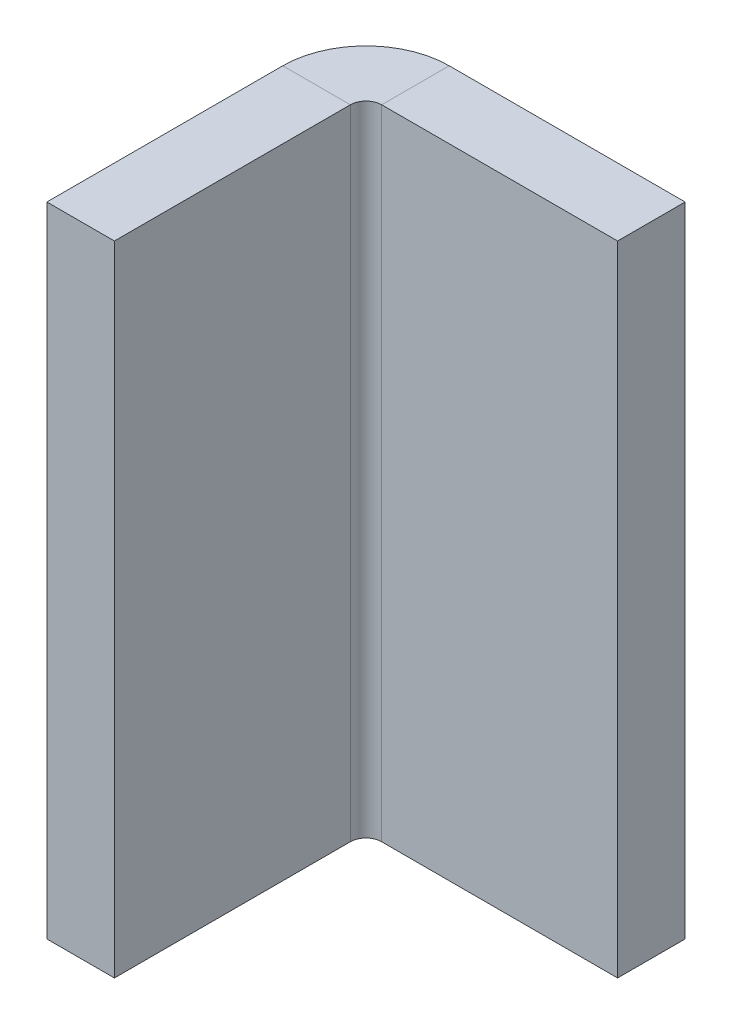
ISO-10303-21;
HEADER;
FILE_DESCRIPTION(('STEP AP214'),'2;1');
FILE_NAME('part.step','',(''),(''),'','','');
FILE_SCHEMA(('AUTOMOTIVE_DESIGN { 1 0 10303 214 1 1 1 1 }'));
ENDSEC;
DATA;
#1=APPLICATION_CONTEXT('core data for automotive mechanical design processes');
#2=APPLICATION_PROTOCOL_DEFINITION('international standard','automotive_design',2000,#1);
#3=PRODUCT_CONTEXT('',#1,'mechanical');
#4=PRODUCT('Part','Part','',(#3));
#5=PRODUCT_RELATED_PRODUCT_CATEGORY('part','',(#4));
#6=PRODUCT_DEFINITION_FORMATION('','',#4);
#7=PRODUCT_DEFINITION_CONTEXT('part definition',#1,'design');
#8=PRODUCT_DEFINITION('design','',#6,#7);
#9=PRODUCT_DEFINITION_SHAPE('','',#8);
#10=(LENGTH_UNIT() NAMED_UNIT(*) SI_UNIT(.MILLI.,.METRE.));
#11=(NAMED_UNIT(*) PLANE_ANGLE_UNIT() SI_UNIT($,.RADIAN.));
#12=(NAMED_UNIT(*) SI_UNIT($,.STERADIAN.) SOLID_ANGLE_UNIT());
#13=UNCERTAINTY_MEASURE_WITH_UNIT(LENGTH_MEASURE(1.E-05),#10,'distance_accuracy_value','');
#14=(GEOMETRIC_REPRESENTATION_CONTEXT(3) GLOBAL_UNCERTAINTY_ASSIGNED_CONTEXT((#13)) GLOBAL_UNIT_ASSIGNED_CONTEXT((#10,
#11,#12)) REPRESENTATION_CONTEXT('',''));
#15=CARTESIAN_POINT('',(0.,0.,0.));
#16=DIRECTION('',(0.,0.,1.));
#17=DIRECTION('',(1.,0.,0.));
#18=AXIS2_PLACEMENT_3D('',#15,#16,#17);
#19=CARTESIAN_POINT('',(15.,-15.,-3.17500000000001));
#20=DIRECTION('',(0.,0.,1.));
#21=DIRECTION('',(0.,-1.,0.));
#22=AXIS2_PLACEMENT_3D('',#19,#20,#21);
#23=PLANE('',#22);
#24=DIRECTION('',(0.,-1.,0.));
#25=VECTOR('',#24,1.);
#26=CARTESIAN_POINT('',(3.9116,-15.,-3.175));
#27=LINE('',#26,#25);
#28=CARTESIAN_POINT('',(3.9116,-15.,-3.175));
#29=VERTEX_POINT('',#28);
#30=CARTESIAN_POINT('',(3.9116,15.,-3.175));
#31=VERTEX_POINT('',#30);
#32=EDGE_CURVE('E164',#29,#31,#27,.F.);
#33=ORIENTED_EDGE('',*,*,#32,.T.);
#34=DIRECTION('',(-1.,0.,0.));
#35=VECTOR('',#34,1.);
#36=CARTESIAN_POINT('',(15.,15.,-3.175));
#37=LINE('',#36,#35);
#38=CARTESIAN_POINT('',(15.,15.,-3.175));
#39=VERTEX_POINT('',#38);
#40=EDGE_CURVE('E13',#39,#31,#37,.T.);
#41=ORIENTED_EDGE('',*,*,#40,.F.);
#42=DIRECTION('',(0.,1.,0.));
#43=VECTOR('',#42,1.);
#44=CARTESIAN_POINT('',(15.,-15.,-3.17500000000001));
#45=LINE('',#44,#43);
#46=CARTESIAN_POINT('',(15.,-15.,-3.17500000000001));
#47=VERTEX_POINT('',#46);
#48=EDGE_CURVE('E185',#47,#39,#45,.T.);
#49=ORIENTED_EDGE('',*,*,#48,.F.);
#50=DIRECTION('',(-1.,0.,0.));
#51=VECTOR('',#50,1.);
#52=CARTESIAN_POINT('',(15.,-15.,-3.17500000000001));
#53=LINE('',#52,#51);
#54=EDGE_CURVE('E70',#47,#29,#53,.T.);
#55=ORIENTED_EDGE('',*,*,#54,.T.);
#56=EDGE_LOOP('',(#33,#41,#49,#55));
#57=FACE_BOUND('',#56,.T.);
#58=ADVANCED_FACE('F56',(#57),#23,.F.);
#59=CARTESIAN_POINT('',(15.,-15.,0.));
#60=DIRECTION('',(0.,0.,1.));
#61=DIRECTION('',(0.,-1.,0.));
#62=AXIS2_PLACEMENT_3D('',#59,#60,#61);
#63=PLANE('',#62);
#64=DIRECTION('',(-1.,0.,0.));
#65=VECTOR('',#64,1.);
#66=CARTESIAN_POINT('',(15.,15.,0.));
#67=LINE('',#66,#65);
#68=CARTESIAN_POINT('',(15.,15.,0.));
#69=VERTEX_POINT('',#68);
#70=CARTESIAN_POINT('',(3.9116,15.,0.));
#71=VERTEX_POINT('',#70);
#72=EDGE_CURVE('E63',#69,#71,#67,.T.);
#73=ORIENTED_EDGE('',*,*,#72,.T.);
#74=DIRECTION('',(0.,-1.,0.));
#75=VECTOR('',#74,1.);
#76=CARTESIAN_POINT('',(3.9116,-15.,0.));
#77=LINE('',#76,#75);
#78=CARTESIAN_POINT('',(3.9116,-15.,0.));
#79=VERTEX_POINT('',#78);
#80=EDGE_CURVE('E176',#79,#71,#77,.F.);
#81=ORIENTED_EDGE('',*,*,#80,.F.);
#82=DIRECTION('',(-1.,0.,0.));
#83=VECTOR('',#82,1.);
#84=CARTESIAN_POINT('',(15.,-15.,0.));
#85=LINE('',#84,#83);
#86=CARTESIAN_POINT('',(15.,-15.,0.));
#87=VERTEX_POINT('',#86);
#88=EDGE_CURVE('E78',#87,#79,#85,.T.);
#89=ORIENTED_EDGE('',*,*,#88,.F.);
#90=DIRECTION('',(0.,1.,0.));
#91=VECTOR('',#90,1.);
#92=CARTESIAN_POINT('',(15.,-15.,0.));
#93=LINE('',#92,#91);
#94=EDGE_CURVE('E191',#87,#69,#93,.T.);
#95=ORIENTED_EDGE('',*,*,#94,.T.);
#96=EDGE_LOOP('',(#73,#81,#89,#95));
#97=FACE_BOUND('',#96,.T.);
#98=ADVANCED_FACE('F197',(#97),#63,.T.);
#99=CARTESIAN_POINT('',(15.,-15.,-3.17500000000001));
#100=DIRECTION('',(0.,-1.,0.));
#101=DIRECTION('',(0.,0.,-1.));
#102=AXIS2_PLACEMENT_3D('',#99,#100,#101);
#103=PLANE('',#102);
#104=ORIENTED_EDGE('',*,*,#88,.T.);
#105=DIRECTION('',(0.,0.,-1.));
#106=VECTOR('',#105,1.);
#107=CARTESIAN_POINT('',(3.9116,-15.,0.));
#108=LINE('',#107,#106);
#109=EDGE_CURVE('E170',#79,#29,#108,.T.);
#110=ORIENTED_EDGE('',*,*,#109,.T.);
#111=ORIENTED_EDGE('',*,*,#54,.F.);
#112=DIRECTION('',(0.,0.,1.));
#113=VECTOR('',#112,1.);
#114=CARTESIAN_POINT('',(15.,-15.,-3.17500000000001));
#115=LINE('',#114,#113);
#116=EDGE_CURVE('E193',#47,#87,#115,.T.);
#117=ORIENTED_EDGE('',*,*,#116,.T.);
#118=EDGE_LOOP('',(#104,#110,#111,#117));
#119=FACE_BOUND('',#118,.T.);
#120=ADVANCED_FACE('F220',(#119),#103,.T.);
#121=CARTESIAN_POINT('',(15.,15.,0.));
#122=DIRECTION('',(0.,1.,0.));
#123=DIRECTION('',(0.,0.,1.));
#124=AXIS2_PLACEMENT_3D('',#121,#122,#123);
#125=PLANE('',#124);
#126=DIRECTION('',(0.,0.,-1.));
#127=VECTOR('',#126,1.);
#128=CARTESIAN_POINT('',(3.9116,15.,0.));
#129=LINE('',#128,#127);
#130=EDGE_CURVE('E182',#71,#31,#129,.T.);
#131=ORIENTED_EDGE('',*,*,#130,.F.);
#132=ORIENTED_EDGE('',*,*,#72,.F.);
#133=DIRECTION('',(0.,0.,-1.));
#134=VECTOR('',#133,1.);
#135=CARTESIAN_POINT('',(15.,15.,0.));
#136=LINE('',#135,#134);
#137=EDGE_CURVE('E188',#69,#39,#136,.T.);
#138=ORIENTED_EDGE('',*,*,#137,.T.);
#139=ORIENTED_EDGE('',*,*,#40,.T.);
#140=EDGE_LOOP('',(#131,#132,#138,#139));
#141=FACE_BOUND('',#140,.T.);
#142=ADVANCED_FACE('F225',(#141),#125,.T.);
#143=CARTESIAN_POINT('',(15.,0.,0.));
#144=DIRECTION('',(-1.,0.,0.));
#145=DIRECTION('',(0.,0.,1.));
#146=AXIS2_PLACEMENT_3D('',#143,#144,#145);
#147=PLANE('',#146);
#148=ORIENTED_EDGE('',*,*,#48,.T.);
#149=ORIENTED_EDGE('',*,*,#137,.F.);
#150=ORIENTED_EDGE('',*,*,#94,.F.);
#151=ORIENTED_EDGE('',*,*,#116,.F.);
#152=EDGE_LOOP('',(#148,#149,#150,#151));
#153=FACE_BOUND('',#152,.T.);
#154=ADVANCED_FACE('F223',(#153),#147,.F.);
#155=CARTESIAN_POINT('',(3.9116,15.,0.736600000000003));
#156=DIRECTION('',(0.,1.,0.));
#157=DIRECTION('',(0.,0.,1.));
#158=AXIS2_PLACEMENT_3D('',#155,#156,#157);
#159=PLANE('',#158);
#160=DIRECTION('',(1.,0.,0.));
#161=VECTOR('',#160,1.);
#162=CARTESIAN_POINT('',(0.,15.,0.736599999999989));
#163=LINE('',#162,#161);
#164=CARTESIAN_POINT('',(3.175,15.,0.736600000000001));
#165=VERTEX_POINT('',#164);
#166=CARTESIAN_POINT('',(0.,15.,0.736599999999989));
#167=VERTEX_POINT('',#166);
#168=EDGE_CURVE('E146',#165,#167,#163,.F.);
#169=ORIENTED_EDGE('',*,*,#168,.F.);
#170=CARTESIAN_POINT('',(3.9116,15.,0.736600000000003));
#171=DIRECTION('',(0.,-1.,0.));
#172=DIRECTION('',(0.,0.,-1.));
#173=AXIS2_PLACEMENT_3D('',#170,#171,#172);
#174=CIRCLE('',#173,0.736600000000001);
#175=EDGE_CURVE('E173',#71,#165,#174,.F.);
#176=ORIENTED_EDGE('',*,*,#175,.F.);
#177=ORIENTED_EDGE('',*,*,#130,.T.);
#178=CARTESIAN_POINT('',(3.9116,15.,0.736600000000003));
#179=DIRECTION('',(0.,-1.,0.));
#180=DIRECTION('',(0.,0.,-1.));
#181=AXIS2_PLACEMENT_3D('',#178,#179,#180);
#182=CIRCLE('',#181,3.9116);
#183=EDGE_CURVE('E166',#31,#167,#182,.F.);
#184=ORIENTED_EDGE('',*,*,#183,.T.);
#185=EDGE_LOOP('',(#169,#176,#177,#184));
#186=FACE_BOUND('',#185,.T.);
#187=ADVANCED_FACE('F206',(#186),#159,.T.);
#188=CARTESIAN_POINT('',(3.9116,-15.,0.736599999999997));
#189=DIRECTION('',(0.,1.,0.));
#190=DIRECTION('',(0.,0.,1.));
#191=AXIS2_PLACEMENT_3D('',#188,#189,#190);
#192=PLANE('',#191);
#193=CARTESIAN_POINT('',(3.9116,-15.,0.736599999999997));
#194=DIRECTION('',(0.,-1.,0.));
#195=DIRECTION('',(0.,0.,-1.));
#196=AXIS2_PLACEMENT_3D('',#193,#194,#195);
#197=CIRCLE('',#196,0.736600000000001);
#198=CARTESIAN_POINT('',(3.175,-15.,0.736599999999994));
#199=VERTEX_POINT('',#198);
#200=EDGE_CURVE('E179',#199,#79,#197,.T.);
#201=ORIENTED_EDGE('',*,*,#200,.F.);
#202=DIRECTION('',(1.,0.,0.));
#203=VECTOR('',#202,1.);
#204=CARTESIAN_POINT('',(3.175,-15.,0.736599999999995));
#205=LINE('',#204,#203);
#206=CARTESIAN_POINT('',(0.,-15.,0.736599999999984));
#207=VERTEX_POINT('',#206);
#208=EDGE_CURVE('E158',#199,#207,#205,.F.);
#209=ORIENTED_EDGE('',*,*,#208,.T.);
#210=CARTESIAN_POINT('',(3.9116,-15.,0.736599999999997));
#211=DIRECTION('',(0.,-1.,0.));
#212=DIRECTION('',(0.,0.,-1.));
#213=AXIS2_PLACEMENT_3D('',#210,#211,#212);
#214=CIRCLE('',#213,3.9116);
#215=EDGE_CURVE('E167',#207,#29,#214,.T.);
#216=ORIENTED_EDGE('',*,*,#215,.T.);
#217=ORIENTED_EDGE('',*,*,#109,.F.);
#218=EDGE_LOOP('',(#201,#209,#216,#217));
#219=FACE_BOUND('',#218,.T.);
#220=ADVANCED_FACE('F219',(#219),#192,.F.);
#221=CARTESIAN_POINT('',(3.9116,-15.,0.736599999999997));
#222=DIRECTION('',(0.,-1.,0.));
#223=DIRECTION('',(-1.,0.,0.));
#224=AXIS2_PLACEMENT_3D('',#221,#222,#223);
#225=CYLINDRICAL_SURFACE('',#224,3.9116);
#226=ORIENTED_EDGE('',*,*,#32,.F.);
#227=ORIENTED_EDGE('',*,*,#215,.F.);
#228=DIRECTION('',(0.,-1.,0.));
#229=VECTOR('',#228,1.);
#230=CARTESIAN_POINT('',(0.,15.,0.736599999999989));
#231=LINE('',#230,#229);
#232=EDGE_CURVE('E156',#207,#167,#231,.F.);
#233=ORIENTED_EDGE('',*,*,#232,.T.);
#234=ORIENTED_EDGE('',*,*,#183,.F.);
#235=EDGE_LOOP('',(#226,#227,#233,#234));
#236=FACE_BOUND('',#235,.T.);
#237=ADVANCED_FACE('F210',(#236),#225,.T.);
#238=CARTESIAN_POINT('',(3.9116,-15.,0.736599999999997));
#239=DIRECTION('',(0.,-1.,0.));
#240=DIRECTION('',(-1.,0.,0.));
#241=AXIS2_PLACEMENT_3D('',#238,#239,#240);
#242=CYLINDRICAL_SURFACE('',#241,0.736600000000001);
#243=ORIENTED_EDGE('',*,*,#80,.T.);
#244=ORIENTED_EDGE('',*,*,#175,.T.);
#245=DIRECTION('',(0.,-1.,0.));
#246=VECTOR('',#245,1.);
#247=CARTESIAN_POINT('',(3.175,15.,0.7366));
#248=LINE('',#247,#246);
#249=EDGE_CURVE('E161',#165,#199,#248,.T.);
#250=ORIENTED_EDGE('',*,*,#249,.T.);
#251=ORIENTED_EDGE('',*,*,#200,.T.);
#252=EDGE_LOOP('',(#243,#244,#250,#251));
#253=FACE_BOUND('',#252,.T.);
#254=ADVANCED_FACE('F202',(#253),#242,.F.);
#255=CARTESIAN_POINT('',(0.,-15.,11.825));
#256=DIRECTION('',(0.,1.,0.));
#257=DIRECTION('',(0.,0.,1.));
#258=AXIS2_PLACEMENT_3D('',#255,#256,#257);
#259=PLANE('',#258);
#260=ORIENTED_EDGE('',*,*,#208,.F.);
#261=DIRECTION('',(0.,0.,-1.));
#262=VECTOR('',#261,1.);
#263=CARTESIAN_POINT('',(3.17499999999996,-15.,11.825));
#264=LINE('',#263,#262);
#265=CARTESIAN_POINT('',(3.17499999999996,-15.,11.825));
#266=VERTEX_POINT('',#265);
#267=EDGE_CURVE('E154',#199,#266,#264,.F.);
#268=ORIENTED_EDGE('',*,*,#267,.T.);
#269=DIRECTION('',(1.,0.,0.));
#270=VECTOR('',#269,1.);
#271=CARTESIAN_POINT('',(0.,-15.,11.825));
#272=LINE('',#271,#270);
#273=CARTESIAN_POINT('',(0.,-15.,11.825));
#274=VERTEX_POINT('',#273);
#275=EDGE_CURVE('E142',#274,#266,#272,.T.);
#276=ORIENTED_EDGE('',*,*,#275,.F.);
#277=DIRECTION('',(0.,0.,1.));
#278=VECTOR('',#277,1.);
#279=CARTESIAN_POINT('',(0.,-15.,0.));
#280=LINE('',#279,#278);
#281=EDGE_CURVE('E129',#207,#274,#280,.T.);
#282=ORIENTED_EDGE('',*,*,#281,.F.);
#283=EDGE_LOOP('',(#260,#268,#276,#282));
#284=FACE_BOUND('',#283,.T.);
#285=ADVANCED_FACE('F213',(#284),#259,.F.);
#286=CARTESIAN_POINT('',(0.,15.,0.));
#287=DIRECTION('',(0.,-1.,0.));
#288=DIRECTION('',(0.,0.,-1.));
#289=AXIS2_PLACEMENT_3D('',#286,#287,#288);
#290=PLANE('',#289);
#291=ORIENTED_EDGE('',*,*,#168,.T.);
#292=DIRECTION('',(0.,0.,-1.));
#293=VECTOR('',#292,1.);
#294=CARTESIAN_POINT('',(0.,15.,0.));
#295=LINE('',#294,#293);
#296=CARTESIAN_POINT('',(0.,15.,11.825));
#297=VERTEX_POINT('',#296);
#298=EDGE_CURVE('E127',#297,#167,#295,.T.);
#299=ORIENTED_EDGE('',*,*,#298,.F.);
#300=DIRECTION('',(1.,0.,0.));
#301=VECTOR('',#300,1.);
#302=CARTESIAN_POINT('',(0.,15.,11.825));
#303=LINE('',#302,#301);
#304=CARTESIAN_POINT('',(3.17499999999996,15.,11.825));
#305=VERTEX_POINT('',#304);
#306=EDGE_CURVE('E135',#297,#305,#303,.T.);
#307=ORIENTED_EDGE('',*,*,#306,.T.);
#308=DIRECTION('',(0.,0.,1.));
#309=VECTOR('',#308,1.);
#310=CARTESIAN_POINT('',(3.175,15.,0.));
#311=LINE('',#310,#309);
#312=EDGE_CURVE('E151',#305,#165,#311,.F.);
#313=ORIENTED_EDGE('',*,*,#312,.T.);
#314=EDGE_LOOP('',(#291,#299,#307,#313));
#315=FACE_BOUND('',#314,.T.);
#316=ADVANCED_FACE('F145',(#315),#290,.F.);
#317=CARTESIAN_POINT('',(0.,0.,0.));
#318=DIRECTION('',(1.,0.,0.));
#319=DIRECTION('',(0.,0.,-1.));
#320=AXIS2_PLACEMENT_3D('',#317,#318,#319);
#321=PLANE('',#320);
#322=ORIENTED_EDGE('',*,*,#232,.F.);
#323=ORIENTED_EDGE('',*,*,#281,.T.);
#324=DIRECTION('',(0.,1.,0.));
#325=VECTOR('',#324,1.);
#326=CARTESIAN_POINT('',(0.,0.,11.825));
#327=LINE('',#326,#325);
#328=EDGE_CURVE('E122',#274,#297,#327,.T.);
#329=ORIENTED_EDGE('',*,*,#328,.T.);
#330=ORIENTED_EDGE('',*,*,#298,.T.);
#331=EDGE_LOOP('',(#322,#323,#329,#330));
#332=FACE_BOUND('',#331,.T.);
#333=ADVANCED_FACE('F125',(#332),#321,.F.);
#334=CARTESIAN_POINT('',(3.175,0.,0.));
#335=DIRECTION('',(1.,0.,0.));
#336=DIRECTION('',(0.,0.,-1.));
#337=AXIS2_PLACEMENT_3D('',#334,#335,#336);
#338=PLANE('',#337);
#339=ORIENTED_EDGE('',*,*,#267,.F.);
#340=ORIENTED_EDGE('',*,*,#249,.F.);
#341=ORIENTED_EDGE('',*,*,#312,.F.);
#342=DIRECTION('',(0.,-1.,0.));
#343=VECTOR('',#342,1.);
#344=CARTESIAN_POINT('',(3.17499999999996,15.,11.825));
#345=LINE('',#344,#343);
#346=EDGE_CURVE('E138',#266,#305,#345,.F.);
#347=ORIENTED_EDGE('',*,*,#346,.F.);
#348=EDGE_LOOP('',(#339,#340,#341,#347));
#349=FACE_BOUND('',#348,.T.);
#350=ADVANCED_FACE('F216',(#349),#338,.T.);
#351=CARTESIAN_POINT('',(0.,15.,11.825));
#352=DIRECTION('',(0.,0.,-1.));
#353=DIRECTION('',(-1.,0.,0.));
#354=AXIS2_PLACEMENT_3D('',#351,#352,#353);
#355=PLANE('',#354);
#356=ORIENTED_EDGE('',*,*,#346,.T.);
#357=ORIENTED_EDGE('',*,*,#306,.F.);
#358=ORIENTED_EDGE('',*,*,#328,.F.);
#359=ORIENTED_EDGE('',*,*,#275,.T.);
#360=EDGE_LOOP('',(#356,#357,#358,#359));
#361=FACE_BOUND('',#360,.T.);
#362=ADVANCED_FACE('F136',(#361),#355,.F.);
#363=CLOSED_SHELL('',(#58,#98,#120,#142,#154,#187,#220,#237,#254,#285,#316,#333,#350,#362));
#364=MANIFOLD_SOLID_BREP('B2',#363);
#365=ADVANCED_BREP_SHAPE_REPRESENTATION('',(#18,#364),#14);
#366=SHAPE_DEFINITION_REPRESENTATION(#9,#365);
ENDSEC;
END-ISO-10303-21;
